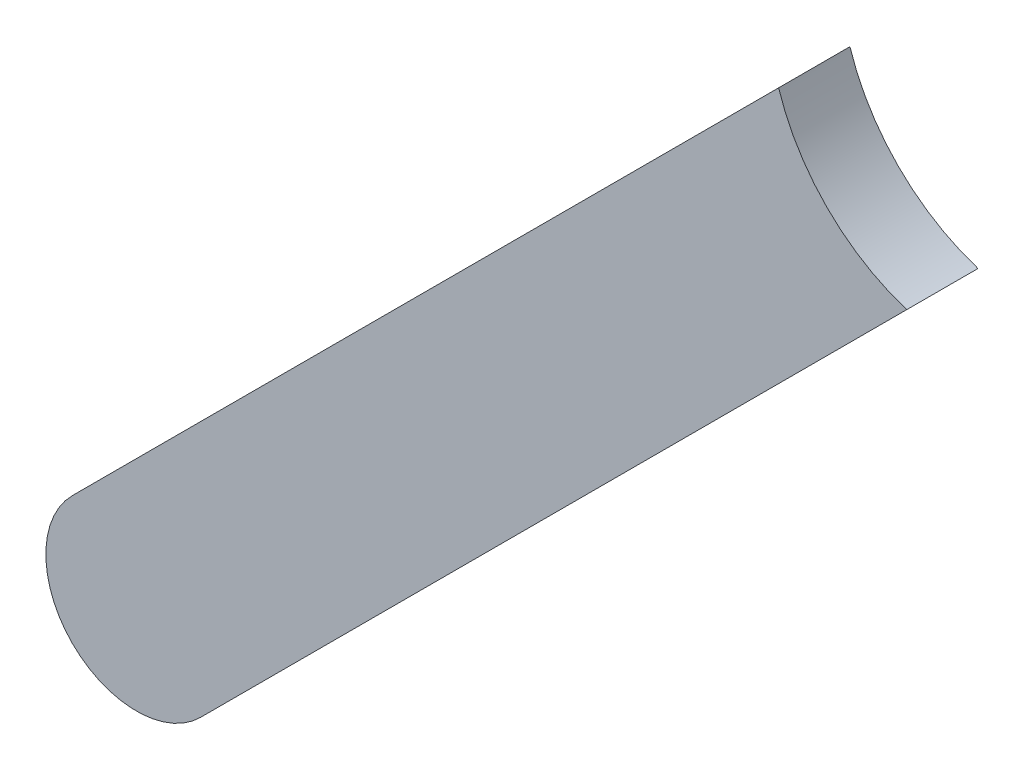
ISO-10303-21;
HEADER;
FILE_DESCRIPTION(('STEP AP214'),'2;1');
FILE_NAME('part.step','',(''),(''),'','','');
FILE_SCHEMA(('AUTOMOTIVE_DESIGN { 1 0 10303 214 1 1 1 1 }'));
ENDSEC;
DATA;
#1=APPLICATION_CONTEXT('core data for automotive mechanical design processes');
#2=APPLICATION_PROTOCOL_DEFINITION('international standard','automotive_design',2000,#1);
#3=PRODUCT_CONTEXT('',#1,'mechanical');
#4=PRODUCT('Part','Part','',(#3));
#5=PRODUCT_RELATED_PRODUCT_CATEGORY('part','',(#4));
#6=PRODUCT_DEFINITION_FORMATION('','',#4);
#7=PRODUCT_DEFINITION_CONTEXT('part definition',#1,'design');
#8=PRODUCT_DEFINITION('design','',#6,#7);
#9=PRODUCT_DEFINITION_SHAPE('','',#8);
#10=(LENGTH_UNIT() NAMED_UNIT(*) SI_UNIT(.MILLI.,.METRE.));
#11=(NAMED_UNIT(*) PLANE_ANGLE_UNIT() SI_UNIT($,.RADIAN.));
#12=(NAMED_UNIT(*) SI_UNIT($,.STERADIAN.) SOLID_ANGLE_UNIT());
#13=UNCERTAINTY_MEASURE_WITH_UNIT(LENGTH_MEASURE(1.E-05),#10,'distance_accuracy_value','');
#14=(GEOMETRIC_REPRESENTATION_CONTEXT(3) GLOBAL_UNCERTAINTY_ASSIGNED_CONTEXT((#13)) GLOBAL_UNIT_ASSIGNED_CONTEXT((#10,
#11,#12)) REPRESENTATION_CONTEXT('',''));
#15=CARTESIAN_POINT('',(0.,0.,0.));
#16=DIRECTION('',(0.,0.,1.));
#17=DIRECTION('',(1.,0.,0.));
#18=AXIS2_PLACEMENT_3D('',#15,#16,#17);
#19=CARTESIAN_POINT('',(111.63480594,91.08985846,0.));
#20=DIRECTION('',(-0.707106781186548,0.707106781186548,0.));
#21=DIRECTION('',(0.707106781186548,0.707106781186548,0.));
#22=AXIS2_PLACEMENT_3D('',#19,#20,#21);
#23=PLANE('',#22);
#24=DIRECTION('',(0.707106781186548,0.707106781186548,0.));
#25=VECTOR('',#24,1.);
#26=CARTESIAN_POINT('',(111.63480594,91.08985846,0.1999996));
#27=LINE('',#26,#25);
#28=CARTESIAN_POINT('',(111.63480594,91.08985846,0.1999996));
#29=VERTEX_POINT('',#28);
#30=CARTESIAN_POINT('',(113.615408458856,93.0704609788559,0.1999996));
#31=VERTEX_POINT('',#30);
#32=EDGE_CURVE('E11',#29,#31,#27,.T.);
#33=ORIENTED_EDGE('',*,*,#32,.F.);
#34=DIRECTION('',(0.,0.,1.));
#35=VECTOR('',#34,1.);
#36=CARTESIAN_POINT('',(111.63480594,91.08985846,0.));
#37=LINE('',#36,#35);
#38=CARTESIAN_POINT('',(111.63480594,91.08985846,0.));
#39=VERTEX_POINT('',#38);
#40=EDGE_CURVE('E24',#39,#29,#37,.T.);
#41=ORIENTED_EDGE('',*,*,#40,.F.);
#42=DIRECTION('',(0.707106781186548,0.707106781186548,0.));
#43=VECTOR('',#42,1.);
#44=CARTESIAN_POINT('',(111.63480594,91.08985846,0.));
#45=LINE('',#44,#43);
#46=CARTESIAN_POINT('',(113.615408458856,93.0704609788559,0.));
#47=VERTEX_POINT('',#46);
#48=EDGE_CURVE('E75',#39,#47,#45,.T.);
#49=ORIENTED_EDGE('',*,*,#48,.T.);
#50=DIRECTION('',(0.,0.,1.));
#51=VECTOR('',#50,1.);
#52=CARTESIAN_POINT('',(113.615408458856,93.0704609788559,0.));
#53=LINE('',#52,#51);
#54=EDGE_CURVE('E37',#47,#31,#53,.T.);
#55=ORIENTED_EDGE('',*,*,#54,.T.);
#56=EDGE_LOOP('',(#33,#41,#49,#55));
#57=FACE_BOUND('',#56,.T.);
#58=ADVANCED_FACE('F17',(#57),#23,.F.);
#59=CARTESIAN_POINT('',(113.7847356,93.599,0.));
#60=DIRECTION('',(0.,0.,-1.));
#61=DIRECTION('',(1.,0.,0.));
#62=AXIS2_PLACEMENT_3D('',#59,#60,#61);
#63=CYLINDRICAL_SURFACE('',#62,0.55500016);
#64=DIRECTION('',(0.,0.,1.));
#65=VECTOR('',#64,1.);
#66=CARTESIAN_POINT('',(113.256196578856,93.4296728588559,0.));
#67=LINE('',#66,#65);
#68=CARTESIAN_POINT('',(113.256196578856,93.4296728588559,0.));
#69=VERTEX_POINT('',#68);
#70=CARTESIAN_POINT('',(113.256196578856,93.4296728588559,0.1999996));
#71=VERTEX_POINT('',#70);
#72=EDGE_CURVE('E67',#69,#71,#67,.T.);
#73=ORIENTED_EDGE('',*,*,#72,.T.);
#74=CARTESIAN_POINT('',(113.7847356,93.599,0.1999996));
#75=DIRECTION('',(0.,0.,1.));
#76=DIRECTION('',(1.,0.,0.));
#77=AXIS2_PLACEMENT_3D('',#74,#75,#76);
#78=CIRCLE('',#77,0.55500016);
#79=EDGE_CURVE('E82',#71,#31,#78,.T.);
#80=ORIENTED_EDGE('',*,*,#79,.T.);
#81=ORIENTED_EDGE('',*,*,#54,.F.);
#82=CARTESIAN_POINT('',(113.7847356,93.599,0.));
#83=DIRECTION('',(0.,0.,1.));
#84=DIRECTION('',(1.,0.,0.));
#85=AXIS2_PLACEMENT_3D('',#82,#83,#84);
#86=CIRCLE('',#85,0.55500016);
#87=EDGE_CURVE('E80',#69,#47,#86,.T.);
#88=ORIENTED_EDGE('',*,*,#87,.F.);
#89=EDGE_LOOP('',(#73,#80,#81,#88));
#90=FACE_BOUND('',#89,.T.);
#91=ADVANCED_FACE('F88',(#90),#63,.F.);
#92=CARTESIAN_POINT('',(113.256196578856,93.4296728588559,0.));
#93=DIRECTION('',(0.707106781186543,-0.707106781186552,0.));
#94=DIRECTION('',(-0.707106781186552,-0.707106781186543,0.));
#95=AXIS2_PLACEMENT_3D('',#92,#93,#94);
#96=PLANE('',#95);
#97=DIRECTION('',(-0.707106781186552,-0.707106781186543,0.));
#98=VECTOR('',#97,1.);
#99=CARTESIAN_POINT('',(113.60512966,93.77860594,0.1999996));
#100=LINE('',#99,#98);
#101=CARTESIAN_POINT('',(111.27559406,91.44907034,0.1999996));
#102=VERTEX_POINT('',#101);
#103=EDGE_CURVE('E71',#71,#102,#100,.T.);
#104=ORIENTED_EDGE('',*,*,#103,.F.);
#105=ORIENTED_EDGE('',*,*,#72,.F.);
#106=DIRECTION('',(-0.707106781186552,-0.707106781186543,0.));
#107=VECTOR('',#106,1.);
#108=CARTESIAN_POINT('',(113.60512966,93.77860594,0.));
#109=LINE('',#108,#107);
#110=CARTESIAN_POINT('',(111.27559406,91.44907034,0.));
#111=VERTEX_POINT('',#110);
#112=EDGE_CURVE('E63',#69,#111,#109,.T.);
#113=ORIENTED_EDGE('',*,*,#112,.T.);
#114=DIRECTION('',(0.,0.,1.));
#115=VECTOR('',#114,1.);
#116=CARTESIAN_POINT('',(111.27559406,91.44907034,0.));
#117=LINE('',#116,#115);
#118=EDGE_CURVE('E53',#111,#102,#117,.T.);
#119=ORIENTED_EDGE('',*,*,#118,.T.);
#120=EDGE_LOOP('',(#104,#105,#113,#119));
#121=FACE_BOUND('',#120,.T.);
#122=ADVANCED_FACE('F66',(#121),#96,.F.);
#123=CARTESIAN_POINT('',(111.4552,91.2694644,0.));
#124=DIRECTION('',(0.,0.,-1.));
#125=DIRECTION('',(-0.707106781186548,0.707106781186548,0.));
#126=AXIS2_PLACEMENT_3D('',#123,#124,#125);
#127=CYLINDRICAL_SURFACE('',#126,0.254001156230778);
#128=CARTESIAN_POINT('',(111.4552,91.2694644,0.1999996));
#129=DIRECTION('',(0.,0.,1.));
#130=DIRECTION('',(-0.707106781186548,0.707106781186548,0.));
#131=AXIS2_PLACEMENT_3D('',#128,#129,#130);
#132=CIRCLE('',#131,0.254001156230778);
#133=EDGE_CURVE('E59',#102,#29,#132,.T.);
#134=ORIENTED_EDGE('',*,*,#133,.F.);
#135=ORIENTED_EDGE('',*,*,#118,.F.);
#136=CARTESIAN_POINT('',(111.4552,91.2694644,0.));
#137=DIRECTION('',(0.,0.,1.));
#138=DIRECTION('',(-0.707106781186548,0.707106781186548,0.));
#139=AXIS2_PLACEMENT_3D('',#136,#137,#138);
#140=CIRCLE('',#139,0.254001156230778);
#141=EDGE_CURVE('E57',#111,#39,#140,.T.);
#142=ORIENTED_EDGE('',*,*,#141,.T.);
#143=ORIENTED_EDGE('',*,*,#40,.T.);
#144=EDGE_LOOP('',(#134,#135,#142,#143));
#145=FACE_BOUND('',#144,.T.);
#146=ADVANCED_FACE('F55',(#145),#127,.T.);
#147=CARTESIAN_POINT('',(111.63480594,91.08985846,0.));
#148=DIRECTION('',(0.,0.,-1.));
#149=DIRECTION('',(-1.,0.,0.));
#150=AXIS2_PLACEMENT_3D('',#147,#148,#149);
#151=PLANE('',#150);
#152=ORIENTED_EDGE('',*,*,#48,.F.);
#153=ORIENTED_EDGE('',*,*,#141,.F.);
#154=ORIENTED_EDGE('',*,*,#112,.F.);
#155=ORIENTED_EDGE('',*,*,#87,.T.);
#156=EDGE_LOOP('',(#152,#153,#154,#155));
#157=FACE_BOUND('',#156,.T.);
#158=ADVANCED_FACE('F74',(#157),#151,.T.);
#159=CARTESIAN_POINT('',(111.63480594,91.08985846,0.1999996));
#160=DIRECTION('',(0.,0.,-1.));
#161=DIRECTION('',(-1.,0.,0.));
#162=AXIS2_PLACEMENT_3D('',#159,#160,#161);
#163=PLANE('',#162);
#164=ORIENTED_EDGE('',*,*,#133,.T.);
#165=ORIENTED_EDGE('',*,*,#32,.T.);
#166=ORIENTED_EDGE('',*,*,#79,.F.);
#167=ORIENTED_EDGE('',*,*,#103,.T.);
#168=EDGE_LOOP('',(#164,#165,#166,#167));
#169=FACE_BOUND('',#168,.T.);
#170=ADVANCED_FACE('F91',(#169),#163,.F.);
#171=CLOSED_SHELL('',(#58,#91,#122,#146,#158,#170));
#172=MANIFOLD_SOLID_BREP('B1',#171);
#173=ADVANCED_BREP_SHAPE_REPRESENTATION('',(#18,#172),#14);
#174=SHAPE_DEFINITION_REPRESENTATION(#9,#173);
ENDSEC;
END-ISO-10303-21;
